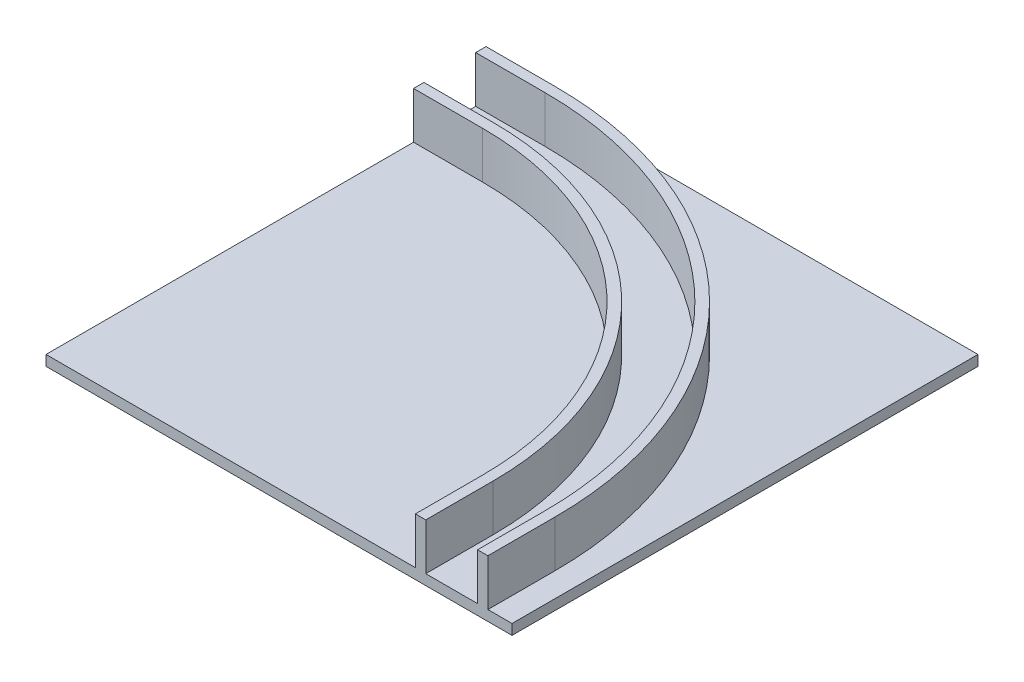
ISO-10303-21;
HEADER;
FILE_DESCRIPTION(('STEP AP214'),'2;1');
FILE_NAME('part.step','',(''),(''),'','','');
FILE_SCHEMA(('AUTOMOTIVE_DESIGN { 1 0 10303 214 1 1 1 1 }'));
ENDSEC;
DATA;
#1=APPLICATION_CONTEXT('core data for automotive mechanical design processes');
#2=APPLICATION_PROTOCOL_DEFINITION('international standard','automotive_design',2000,#1);
#3=PRODUCT_CONTEXT('',#1,'mechanical');
#4=PRODUCT('Part','Part','',(#3));
#5=PRODUCT_RELATED_PRODUCT_CATEGORY('part','',(#4));
#6=PRODUCT_DEFINITION_FORMATION('','',#4);
#7=PRODUCT_DEFINITION_CONTEXT('part definition',#1,'design');
#8=PRODUCT_DEFINITION('design','',#6,#7);
#9=PRODUCT_DEFINITION_SHAPE('','',#8);
#10=(LENGTH_UNIT() NAMED_UNIT(*) SI_UNIT(.MILLI.,.METRE.));
#11=(NAMED_UNIT(*) PLANE_ANGLE_UNIT() SI_UNIT($,.RADIAN.));
#12=(NAMED_UNIT(*) SI_UNIT($,.STERADIAN.) SOLID_ANGLE_UNIT());
#13=UNCERTAINTY_MEASURE_WITH_UNIT(LENGTH_MEASURE(1.E-05),#10,'distance_accuracy_value','');
#14=(GEOMETRIC_REPRESENTATION_CONTEXT(3) GLOBAL_UNCERTAINTY_ASSIGNED_CONTEXT((#13)) GLOBAL_UNIT_ASSIGNED_CONTEXT((#10,
#11,#12)) REPRESENTATION_CONTEXT('',''));
#15=CARTESIAN_POINT('',(0.,0.,0.));
#16=DIRECTION('',(0.,0.,1.));
#17=DIRECTION('',(1.,0.,0.));
#18=AXIS2_PLACEMENT_3D('',#15,#16,#17);
#19=CARTESIAN_POINT('',(0.,2.,0.));
#20=DIRECTION('',(0.,-1.,0.));
#21=DIRECTION('',(0.,0.,-1.));
#22=AXIS2_PLACEMENT_3D('',#19,#20,#21);
#23=PLANE('',#22);
#24=DIRECTION('',(0.,0.,1.));
#25=VECTOR('',#24,1.);
#26=CARTESIAN_POINT('',(26.3431101007559,2.,32.0158855578953));
#27=LINE('',#26,#25);
#28=CARTESIAN_POINT('',(26.3431101007559,2.,32.0158855578953));
#29=VERTEX_POINT('',#28);
#30=CARTESIAN_POINT('',(26.3431101007559,2.,45.));
#31=VERTEX_POINT('',#30);
#32=EDGE_CURVE('E250',#29,#31,#27,.T.);
#33=ORIENTED_EDGE('',*,*,#32,.F.);
#34=CARTESIAN_POINT('',(-31.6568898992441,2.,32.0158855578953));
#35=DIRECTION('',(0.,1.,0.));
#36=DIRECTION('',(1.,0.,0.));
#37=AXIS2_PLACEMENT_3D('',#34,#35,#36);
#38=CIRCLE('',#37,58.);
#39=CARTESIAN_POINT('',(-31.6568898992441,2.,-25.9841144421047));
#40=VERTEX_POINT('',#39);
#41=EDGE_CURVE('E244',#40,#29,#38,.F.);
#42=ORIENTED_EDGE('',*,*,#41,.F.);
#43=DIRECTION('',(1.,0.,0.));
#44=VECTOR('',#43,1.);
#45=CARTESIAN_POINT('',(-31.6568898992441,2.,-25.9841144421047));
#46=LINE('',#45,#44);
#47=CARTESIAN_POINT('',(-45.,2.,-25.9841144421047));
#48=VERTEX_POINT('',#47);
#49=EDGE_CURVE('E292',#48,#40,#46,.T.);
#50=ORIENTED_EDGE('',*,*,#49,.F.);
#51=DIRECTION('',(0.,0.,1.));
#52=VECTOR('',#51,1.);
#53=CARTESIAN_POINT('',(-45.,2.,-45.));
#54=LINE('',#53,#52);
#55=CARTESIAN_POINT('',(-45.,2.,45.));
#56=VERTEX_POINT('',#55);
#57=EDGE_CURVE('E405',#48,#56,#54,.T.);
#58=ORIENTED_EDGE('',*,*,#57,.T.);
#59=DIRECTION('',(1.,0.,0.));
#60=VECTOR('',#59,1.);
#61=CARTESIAN_POINT('',(45.,2.,45.));
#62=LINE('',#61,#60);
#63=EDGE_CURVE('E406',#56,#31,#62,.T.);
#64=ORIENTED_EDGE('',*,*,#63,.T.);
#65=EDGE_LOOP('',(#33,#42,#50,#58,#64));
#66=FACE_BOUND('',#65,.T.);
#67=ADVANCED_FACE('F93',(#66),#23,.F.);
#68=CARTESIAN_POINT('',(-31.6568898992441,2.,32.0158855578953));
#69=DIRECTION('',(0.,-1.,0.));
#70=DIRECTION('',(0.,0.,1.));
#71=AXIS2_PLACEMENT_3D('',#68,#69,#70);
#72=CIRCLE('',#71,60.);
#73=CARTESIAN_POINT('',(-31.6568898992441,2.,-27.9841144421047));
#74=VERTEX_POINT('',#73);
#75=CARTESIAN_POINT('',(28.3431101007559,2.,32.0158855578953));
#76=VERTEX_POINT('',#75);
#77=EDGE_CURVE('E109',#74,#76,#72,.T.);
#78=ORIENTED_EDGE('',*,*,#77,.T.);
#79=DIRECTION('',(0.,0.,1.));
#80=VECTOR('',#79,1.);
#81=CARTESIAN_POINT('',(28.3431101007559,2.,32.0158855578953));
#82=LINE('',#81,#80);
#83=CARTESIAN_POINT('',(28.3431101007559,2.,45.));
#84=VERTEX_POINT('',#83);
#85=EDGE_CURVE('E285',#76,#84,#82,.T.);
#86=ORIENTED_EDGE('',*,*,#85,.T.);
#87=CARTESIAN_POINT('',(38.3431101007559,2.,45.));
#88=VERTEX_POINT('',#87);
#89=EDGE_CURVE('E410',#84,#88,#62,.T.);
#90=ORIENTED_EDGE('',*,*,#89,.T.);
#91=DIRECTION('',(0.,0.,1.));
#92=VECTOR('',#91,1.);
#93=CARTESIAN_POINT('',(38.3431101007559,2.,32.0158855578953));
#94=LINE('',#93,#92);
#95=CARTESIAN_POINT('',(38.3431101007559,2.,32.0158855578953));
#96=VERTEX_POINT('',#95);
#97=EDGE_CURVE('E254',#96,#88,#94,.T.);
#98=ORIENTED_EDGE('',*,*,#97,.F.);
#99=CARTESIAN_POINT('',(-31.6568898992441,2.,32.0158855578953));
#100=DIRECTION('',(0.,1.,0.));
#101=DIRECTION('',(1.,0.,0.));
#102=AXIS2_PLACEMENT_3D('',#99,#100,#101);
#103=CIRCLE('',#102,70.);
#104=CARTESIAN_POINT('',(-31.6568898992441,2.,-37.9841144421047));
#105=VERTEX_POINT('',#104);
#106=EDGE_CURVE('E325',#105,#96,#103,.F.);
#107=ORIENTED_EDGE('',*,*,#106,.F.);
#108=DIRECTION('',(1.,0.,0.));
#109=VECTOR('',#108,1.);
#110=CARTESIAN_POINT('',(-31.6568898992441,2.,-37.9841144421047));
#111=LINE('',#110,#109);
#112=CARTESIAN_POINT('',(-45.,2.,-37.9841144421047));
#113=VERTEX_POINT('',#112);
#114=EDGE_CURVE('E367',#113,#105,#111,.T.);
#115=ORIENTED_EDGE('',*,*,#114,.F.);
#116=CARTESIAN_POINT('',(-45.,2.,-27.9841144421047));
#117=VERTEX_POINT('',#116);
#118=EDGE_CURVE('E404',#113,#117,#54,.T.);
#119=ORIENTED_EDGE('',*,*,#118,.T.);
#120=DIRECTION('',(1.,0.,0.));
#121=VECTOR('',#120,1.);
#122=CARTESIAN_POINT('',(-31.6568898992441,2.,-27.9841144421047));
#123=LINE('',#122,#121);
#124=EDGE_CURVE('E114',#117,#74,#123,.T.);
#125=ORIENTED_EDGE('',*,*,#124,.T.);
#126=EDGE_LOOP('',(#78,#86,#90,#98,#107,#115,#119,#125));
#127=FACE_BOUND('',#126,.T.);
#128=ADVANCED_FACE('F462',(#127),#23,.F.);
#129=CARTESIAN_POINT('',(-45.,2.,-45.));
#130=DIRECTION('',(1.,0.,0.));
#131=DIRECTION('',(0.,0.,-1.));
#132=AXIS2_PLACEMENT_3D('',#129,#130,#131);
#133=PLANE('',#132);
#134=DIRECTION('',(0.,0.,1.));
#135=VECTOR('',#134,1.);
#136=CARTESIAN_POINT('',(-45.,0.,-45.));
#137=LINE('',#136,#135);
#138=CARTESIAN_POINT('',(-45.,0.,-45.));
#139=VERTEX_POINT('',#138);
#140=CARTESIAN_POINT('',(-45.,0.,45.));
#141=VERTEX_POINT('',#140);
#142=EDGE_CURVE('E398',#139,#141,#137,.T.);
#143=ORIENTED_EDGE('',*,*,#142,.T.);
#144=DIRECTION('',(0.,-1.,0.));
#145=VECTOR('',#144,1.);
#146=CARTESIAN_POINT('',(-45.,2.,45.));
#147=LINE('',#146,#145);
#148=EDGE_CURVE('E12',#56,#141,#147,.T.);
#149=ORIENTED_EDGE('',*,*,#148,.F.);
#150=ORIENTED_EDGE('',*,*,#57,.F.);
#151=DIRECTION('',(0.,-1.,0.));
#152=VECTOR('',#151,1.);
#153=CARTESIAN_POINT('',(-45.,11.,-25.9841144421047));
#154=LINE('',#153,#152);
#155=CARTESIAN_POINT('',(-45.,11.,-25.9841144421047));
#156=VERTEX_POINT('',#155);
#157=EDGE_CURVE('E305',#156,#48,#154,.T.);
#158=ORIENTED_EDGE('',*,*,#157,.F.);
#159=DIRECTION('',(0.,0.,-1.));
#160=VECTOR('',#159,1.);
#161=CARTESIAN_POINT('',(-45.,11.,-25.9841144421047));
#162=LINE('',#161,#160);
#163=CARTESIAN_POINT('',(-45.,11.,-27.9841144421047));
#164=VERTEX_POINT('',#163);
#165=EDGE_CURVE('E273',#156,#164,#162,.T.);
#166=ORIENTED_EDGE('',*,*,#165,.T.);
#167=DIRECTION('',(0.,-1.,0.));
#168=VECTOR('',#167,1.);
#169=CARTESIAN_POINT('',(-45.,11.,-27.9841144421047));
#170=LINE('',#169,#168);
#171=EDGE_CURVE('E309',#164,#117,#170,.T.);
#172=ORIENTED_EDGE('',*,*,#171,.T.);
#173=ORIENTED_EDGE('',*,*,#118,.F.);
#174=DIRECTION('',(0.,-1.,0.));
#175=VECTOR('',#174,1.);
#176=CARTESIAN_POINT('',(-45.,11.,-37.9841144421047));
#177=LINE('',#176,#175);
#178=CARTESIAN_POINT('',(-45.,11.,-37.9841144421047));
#179=VERTEX_POINT('',#178);
#180=EDGE_CURVE('E379',#179,#113,#177,.T.);
#181=ORIENTED_EDGE('',*,*,#180,.F.);
#182=DIRECTION('',(0.,0.,-1.));
#183=VECTOR('',#182,1.);
#184=CARTESIAN_POINT('',(-45.,11.,-37.9841144421047));
#185=LINE('',#184,#183);
#186=CARTESIAN_POINT('',(-45.,11.,-39.9841144421047));
#187=VERTEX_POINT('',#186);
#188=EDGE_CURVE('E341',#179,#187,#185,.T.);
#189=ORIENTED_EDGE('',*,*,#188,.T.);
#190=DIRECTION('',(0.,-1.,0.));
#191=VECTOR('',#190,1.);
#192=CARTESIAN_POINT('',(-45.,11.,-39.9841144421047));
#193=LINE('',#192,#191);
#194=CARTESIAN_POINT('',(-45.,2.,-39.9841144421047));
#195=VERTEX_POINT('',#194);
#196=EDGE_CURVE('E382',#187,#195,#193,.T.);
#197=ORIENTED_EDGE('',*,*,#196,.T.);
#198=CARTESIAN_POINT('',(-45.,2.,-45.));
#199=VERTEX_POINT('',#198);
#200=EDGE_CURVE('E399',#199,#195,#54,.T.);
#201=ORIENTED_EDGE('',*,*,#200,.F.);
#202=DIRECTION('',(0.,-1.,0.));
#203=VECTOR('',#202,1.);
#204=CARTESIAN_POINT('',(-45.,2.,-45.));
#205=LINE('',#204,#203);
#206=EDGE_CURVE('E416',#199,#139,#205,.T.);
#207=ORIENTED_EDGE('',*,*,#206,.T.);
#208=EDGE_LOOP('',(#143,#149,#150,#158,#166,#172,#173,#181,#189,#197,#201,#207));
#209=FACE_BOUND('',#208,.T.);
#210=ADVANCED_FACE('F95',(#209),#133,.F.);
#211=CARTESIAN_POINT('',(45.,2.,45.));
#212=DIRECTION('',(0.,0.,-1.));
#213=DIRECTION('',(-1.,0.,0.));
#214=AXIS2_PLACEMENT_3D('',#211,#212,#213);
#215=PLANE('',#214);
#216=DIRECTION('',(1.,0.,0.));
#217=VECTOR('',#216,1.);
#218=CARTESIAN_POINT('',(45.,0.,45.));
#219=LINE('',#218,#217);
#220=CARTESIAN_POINT('',(45.,0.,45.));
#221=VERTEX_POINT('',#220);
#222=EDGE_CURVE('E420',#141,#221,#219,.T.);
#223=ORIENTED_EDGE('',*,*,#222,.T.);
#224=DIRECTION('',(0.,-1.,0.));
#225=VECTOR('',#224,1.);
#226=CARTESIAN_POINT('',(45.,2.,45.));
#227=LINE('',#226,#225);
#228=CARTESIAN_POINT('',(45.,2.,45.));
#229=VERTEX_POINT('',#228);
#230=EDGE_CURVE('E102',#229,#221,#227,.T.);
#231=ORIENTED_EDGE('',*,*,#230,.F.);
#232=CARTESIAN_POINT('',(40.3431101007559,2.,45.));
#233=VERTEX_POINT('',#232);
#234=EDGE_CURVE('E403',#233,#229,#62,.T.);
#235=ORIENTED_EDGE('',*,*,#234,.F.);
#236=DIRECTION('',(0.,-1.,0.));
#237=VECTOR('',#236,1.);
#238=CARTESIAN_POINT('',(40.3431101007559,11.,45.));
#239=LINE('',#238,#237);
#240=CARTESIAN_POINT('',(40.3431101007559,11.,45.));
#241=VERTEX_POINT('',#240);
#242=EDGE_CURVE('E391',#241,#233,#239,.T.);
#243=ORIENTED_EDGE('',*,*,#242,.F.);
#244=DIRECTION('',(-1.,0.,0.));
#245=VECTOR('',#244,1.);
#246=CARTESIAN_POINT('',(40.3431101007559,11.,45.));
#247=LINE('',#246,#245);
#248=CARTESIAN_POINT('',(38.3431101007559,11.,45.));
#249=VERTEX_POINT('',#248);
#250=EDGE_CURVE('E324',#241,#249,#247,.T.);
#251=ORIENTED_EDGE('',*,*,#250,.T.);
#252=DIRECTION('',(0.,-1.,0.));
#253=VECTOR('',#252,1.);
#254=CARTESIAN_POINT('',(38.3431101007559,11.,45.));
#255=LINE('',#254,#253);
#256=EDGE_CURVE('E394',#249,#88,#255,.T.);
#257=ORIENTED_EDGE('',*,*,#256,.T.);
#258=ORIENTED_EDGE('',*,*,#89,.F.);
#259=DIRECTION('',(0.,-1.,0.));
#260=VECTOR('',#259,1.);
#261=CARTESIAN_POINT('',(28.3431101007559,11.,45.));
#262=LINE('',#261,#260);
#263=CARTESIAN_POINT('',(28.3431101007559,11.,45.));
#264=VERTEX_POINT('',#263);
#265=EDGE_CURVE('E255',#264,#84,#262,.T.);
#266=ORIENTED_EDGE('',*,*,#265,.F.);
#267=DIRECTION('',(-1.,0.,0.));
#268=VECTOR('',#267,1.);
#269=CARTESIAN_POINT('',(28.3431101007559,11.,45.));
#270=LINE('',#269,#268);
#271=CARTESIAN_POINT('',(26.3431101007559,11.,45.));
#272=VERTEX_POINT('',#271);
#273=EDGE_CURVE('E236',#264,#272,#270,.T.);
#274=ORIENTED_EDGE('',*,*,#273,.T.);
#275=DIRECTION('',(0.,-1.,0.));
#276=VECTOR('',#275,1.);
#277=CARTESIAN_POINT('',(26.3431101007559,11.,45.));
#278=LINE('',#277,#276);
#279=EDGE_CURVE('E248',#272,#31,#278,.T.);
#280=ORIENTED_EDGE('',*,*,#279,.T.);
#281=ORIENTED_EDGE('',*,*,#63,.F.);
#282=ORIENTED_EDGE('',*,*,#148,.T.);
#283=EDGE_LOOP('',(#223,#231,#235,#243,#251,#257,#258,#266,#274,#280,#281,#282));
#284=FACE_BOUND('',#283,.T.);
#285=ADVANCED_FACE('F257',(#284),#215,.F.);
#286=CARTESIAN_POINT('',(45.,2.,-45.));
#287=DIRECTION('',(-1.,0.,0.));
#288=DIRECTION('',(0.,0.,1.));
#289=AXIS2_PLACEMENT_3D('',#286,#287,#288);
#290=PLANE('',#289);
#291=DIRECTION('',(0.,0.,-1.));
#292=VECTOR('',#291,1.);
#293=CARTESIAN_POINT('',(45.,0.,-45.));
#294=LINE('',#293,#292);
#295=CARTESIAN_POINT('',(45.,0.,-45.));
#296=VERTEX_POINT('',#295);
#297=EDGE_CURVE('E423',#221,#296,#294,.T.);
#298=ORIENTED_EDGE('',*,*,#297,.T.);
#299=DIRECTION('',(0.,-1.,0.));
#300=VECTOR('',#299,1.);
#301=CARTESIAN_POINT('',(45.,2.,-45.));
#302=LINE('',#301,#300);
#303=CARTESIAN_POINT('',(45.,2.,-45.));
#304=VERTEX_POINT('',#303);
#305=EDGE_CURVE('E432',#304,#296,#302,.T.);
#306=ORIENTED_EDGE('',*,*,#305,.F.);
#307=DIRECTION('',(0.,0.,-1.));
#308=VECTOR('',#307,1.);
#309=CARTESIAN_POINT('',(45.,2.,-45.));
#310=LINE('',#309,#308);
#311=EDGE_CURVE('E409',#229,#304,#310,.T.);
#312=ORIENTED_EDGE('',*,*,#311,.F.);
#313=ORIENTED_EDGE('',*,*,#230,.T.);
#314=EDGE_LOOP('',(#298,#306,#312,#313));
#315=FACE_BOUND('',#314,.T.);
#316=ADVANCED_FACE('F441',(#315),#290,.F.);
#317=CARTESIAN_POINT('',(45.,2.,-45.));
#318=DIRECTION('',(0.,0.,1.));
#319=DIRECTION('',(1.,0.,0.));
#320=AXIS2_PLACEMENT_3D('',#317,#318,#319);
#321=PLANE('',#320);
#322=DIRECTION('',(-1.,0.,0.));
#323=VECTOR('',#322,1.);
#324=CARTESIAN_POINT('',(45.,0.,-45.));
#325=LINE('',#324,#323);
#326=EDGE_CURVE('E426',#296,#139,#325,.T.);
#327=ORIENTED_EDGE('',*,*,#326,.T.);
#328=ORIENTED_EDGE('',*,*,#206,.F.);
#329=DIRECTION('',(-1.,0.,0.));
#330=VECTOR('',#329,1.);
#331=CARTESIAN_POINT('',(45.,2.,-45.));
#332=LINE('',#331,#330);
#333=EDGE_CURVE('E413',#304,#199,#332,.T.);
#334=ORIENTED_EDGE('',*,*,#333,.F.);
#335=ORIENTED_EDGE('',*,*,#305,.T.);
#336=EDGE_LOOP('',(#327,#328,#334,#335));
#337=FACE_BOUND('',#336,.T.);
#338=ADVANCED_FACE('F450',(#337),#321,.F.);
#339=ORIENTED_EDGE('',*,*,#200,.T.);
#340=DIRECTION('',(1.,0.,0.));
#341=VECTOR('',#340,1.);
#342=CARTESIAN_POINT('',(-31.6568898992441,2.,-39.9841144421047));
#343=LINE('',#342,#341);
#344=CARTESIAN_POINT('',(-31.6568898992441,2.,-39.9841144421047));
#345=VERTEX_POINT('',#344);
#346=EDGE_CURVE('E363',#195,#345,#343,.T.);
#347=ORIENTED_EDGE('',*,*,#346,.T.);
#348=CARTESIAN_POINT('',(-31.6568898992441,2.,32.0158855578953));
#349=DIRECTION('',(0.,-1.,0.));
#350=DIRECTION('',(0.,0.,1.));
#351=AXIS2_PLACEMENT_3D('',#348,#349,#350);
#352=CIRCLE('',#351,72.);
#353=CARTESIAN_POINT('',(40.3431101007559,2.,32.0158855578953));
#354=VERTEX_POINT('',#353);
#355=EDGE_CURVE('E359',#345,#354,#352,.T.);
#356=ORIENTED_EDGE('',*,*,#355,.T.);
#357=DIRECTION('',(0.,0.,1.));
#358=VECTOR('',#357,1.);
#359=CARTESIAN_POINT('',(40.3431101007559,2.,32.0158855578953));
#360=LINE('',#359,#358);
#361=EDGE_CURVE('E355',#354,#233,#360,.T.);
#362=ORIENTED_EDGE('',*,*,#361,.T.);
#363=ORIENTED_EDGE('',*,*,#234,.T.);
#364=ORIENTED_EDGE('',*,*,#311,.T.);
#365=ORIENTED_EDGE('',*,*,#333,.T.);
#366=EDGE_LOOP('',(#339,#347,#356,#362,#363,#364,#365));
#367=FACE_BOUND('',#366,.T.);
#368=ADVANCED_FACE('F457',(#367),#23,.F.);
#369=CARTESIAN_POINT('',(0.,0.,0.));
#370=DIRECTION('',(0.,-1.,0.));
#371=DIRECTION('',(0.,0.,-1.));
#372=AXIS2_PLACEMENT_3D('',#369,#370,#371);
#373=PLANE('',#372);
#374=ORIENTED_EDGE('',*,*,#142,.F.);
#375=ORIENTED_EDGE('',*,*,#326,.F.);
#376=ORIENTED_EDGE('',*,*,#297,.F.);
#377=ORIENTED_EDGE('',*,*,#222,.F.);
#378=EDGE_LOOP('',(#374,#375,#376,#377));
#379=FACE_BOUND('',#378,.T.);
#380=ADVANCED_FACE('F447',(#379),#373,.T.);
#381=CARTESIAN_POINT('',(38.3431101007559,11.,32.0158855578953));
#382=DIRECTION('',(1.,0.,0.));
#383=DIRECTION('',(0.,0.,-1.));
#384=AXIS2_PLACEMENT_3D('',#381,#382,#383);
#385=PLANE('',#384);
#386=ORIENTED_EDGE('',*,*,#97,.T.);
#387=ORIENTED_EDGE('',*,*,#256,.F.);
#388=DIRECTION('',(0.,0.,1.));
#389=VECTOR('',#388,1.);
#390=CARTESIAN_POINT('',(38.3431101007559,11.,32.0158855578953));
#391=LINE('',#390,#389);
#392=CARTESIAN_POINT('',(38.3431101007559,11.,32.0158855578953));
#393=VERTEX_POINT('',#392);
#394=EDGE_CURVE('E321',#393,#249,#391,.T.);
#395=ORIENTED_EDGE('',*,*,#394,.F.);
#396=DIRECTION('',(0.,-1.,0.));
#397=VECTOR('',#396,1.);
#398=CARTESIAN_POINT('',(38.3431101007559,11.,32.0158855578953));
#399=LINE('',#398,#397);
#400=EDGE_CURVE('E351',#393,#96,#399,.T.);
#401=ORIENTED_EDGE('',*,*,#400,.T.);
#402=EDGE_LOOP('',(#386,#387,#395,#401));
#403=FACE_BOUND('',#402,.T.);
#404=ADVANCED_FACE('F469',(#403),#385,.F.);
#405=CARTESIAN_POINT('',(40.3431101007559,11.,32.0158855578953));
#406=DIRECTION('',(1.,0.,0.));
#407=DIRECTION('',(0.,0.,-1.));
#408=AXIS2_PLACEMENT_3D('',#405,#406,#407);
#409=PLANE('',#408);
#410=ORIENTED_EDGE('',*,*,#361,.F.);
#411=DIRECTION('',(0.,-1.,0.));
#412=VECTOR('',#411,1.);
#413=CARTESIAN_POINT('',(40.3431101007559,11.,32.0158855578953));
#414=LINE('',#413,#412);
#415=CARTESIAN_POINT('',(40.3431101007559,11.,32.0158855578953));
#416=VERTEX_POINT('',#415);
#417=EDGE_CURVE('E388',#416,#354,#414,.T.);
#418=ORIENTED_EDGE('',*,*,#417,.F.);
#419=DIRECTION('',(0.,0.,1.));
#420=VECTOR('',#419,1.);
#421=CARTESIAN_POINT('',(40.3431101007559,11.,32.0158855578953));
#422=LINE('',#421,#420);
#423=EDGE_CURVE('E329',#416,#241,#422,.T.);
#424=ORIENTED_EDGE('',*,*,#423,.T.);
#425=ORIENTED_EDGE('',*,*,#242,.T.);
#426=EDGE_LOOP('',(#410,#418,#424,#425));
#427=FACE_BOUND('',#426,.T.);
#428=ADVANCED_FACE('F583',(#427),#409,.T.);
#429=CARTESIAN_POINT('',(-31.6568898992441,11.,32.0158855578953));
#430=DIRECTION('',(0.,-1.,0.));
#431=DIRECTION('',(0.,0.,-1.));
#432=AXIS2_PLACEMENT_3D('',#429,#430,#431);
#433=CYLINDRICAL_SURFACE('',#432,72.);
#434=ORIENTED_EDGE('',*,*,#355,.F.);
#435=DIRECTION('',(0.,-1.,0.));
#436=VECTOR('',#435,1.);
#437=CARTESIAN_POINT('',(-31.6568898992441,11.,-39.9841144421047));
#438=LINE('',#437,#436);
#439=CARTESIAN_POINT('',(-31.6568898992441,11.,-39.9841144421047));
#440=VERTEX_POINT('',#439);
#441=EDGE_CURVE('E385',#440,#345,#438,.T.);
#442=ORIENTED_EDGE('',*,*,#441,.F.);
#443=CARTESIAN_POINT('',(-31.6568898992441,11.,32.0158855578953));
#444=DIRECTION('',(0.,-1.,0.));
#445=DIRECTION('',(0.,0.,1.));
#446=AXIS2_PLACEMENT_3D('',#443,#444,#445);
#447=CIRCLE('',#446,72.);
#448=EDGE_CURVE('E333',#440,#416,#447,.T.);
#449=ORIENTED_EDGE('',*,*,#448,.T.);
#450=ORIENTED_EDGE('',*,*,#417,.T.);
#451=EDGE_LOOP('',(#434,#442,#449,#450));
#452=FACE_BOUND('',#451,.T.);
#453=ADVANCED_FACE('F591',(#452),#433,.T.);
#454=CARTESIAN_POINT('',(-31.6568898992441,11.,-39.9841144421047));
#455=DIRECTION('',(0.,0.,-1.));
#456=DIRECTION('',(-1.,0.,0.));
#457=AXIS2_PLACEMENT_3D('',#454,#455,#456);
#458=PLANE('',#457);
#459=ORIENTED_EDGE('',*,*,#346,.F.);
#460=ORIENTED_EDGE('',*,*,#196,.F.);
#461=DIRECTION('',(1.,0.,0.));
#462=VECTOR('',#461,1.);
#463=CARTESIAN_POINT('',(-31.6568898992441,11.,-39.9841144421047));
#464=LINE('',#463,#462);
#465=EDGE_CURVE('E337',#187,#440,#464,.T.);
#466=ORIENTED_EDGE('',*,*,#465,.T.);
#467=ORIENTED_EDGE('',*,*,#441,.T.);
#468=EDGE_LOOP('',(#459,#460,#466,#467));
#469=FACE_BOUND('',#468,.T.);
#470=ADVANCED_FACE('F601',(#469),#458,.T.);
#471=CARTESIAN_POINT('',(-31.6568898992441,11.,-37.9841144421047));
#472=DIRECTION('',(0.,0.,-1.));
#473=DIRECTION('',(-1.,0.,0.));
#474=AXIS2_PLACEMENT_3D('',#471,#472,#473);
#475=PLANE('',#474);
#476=ORIENTED_EDGE('',*,*,#114,.T.);
#477=DIRECTION('',(0.,-1.,0.));
#478=VECTOR('',#477,1.);
#479=CARTESIAN_POINT('',(-31.6568898992441,11.,-37.9841144421047));
#480=LINE('',#479,#478);
#481=CARTESIAN_POINT('',(-31.6568898992441,11.,-37.9841144421047));
#482=VERTEX_POINT('',#481);
#483=EDGE_CURVE('E375',#482,#105,#480,.T.);
#484=ORIENTED_EDGE('',*,*,#483,.F.);
#485=DIRECTION('',(1.,0.,0.));
#486=VECTOR('',#485,1.);
#487=CARTESIAN_POINT('',(-31.6568898992441,11.,-37.9841144421047));
#488=LINE('',#487,#486);
#489=EDGE_CURVE('E345',#179,#482,#488,.T.);
#490=ORIENTED_EDGE('',*,*,#489,.F.);
#491=ORIENTED_EDGE('',*,*,#180,.T.);
#492=EDGE_LOOP('',(#476,#484,#490,#491));
#493=FACE_BOUND('',#492,.T.);
#494=ADVANCED_FACE('F611',(#493),#475,.F.);
#495=CARTESIAN_POINT('',(-31.6568898992441,11.,32.0158855578953));
#496=DIRECTION('',(0.,-1.,0.));
#497=DIRECTION('',(0.,0.,-1.));
#498=AXIS2_PLACEMENT_3D('',#495,#496,#497);
#499=CYLINDRICAL_SURFACE('',#498,70.);
#500=ORIENTED_EDGE('',*,*,#106,.T.);
#501=ORIENTED_EDGE('',*,*,#400,.F.);
#502=CARTESIAN_POINT('',(-31.6568898992441,11.,32.0158855578953));
#503=DIRECTION('',(0.,1.,0.));
#504=DIRECTION('',(1.,0.,0.));
#505=AXIS2_PLACEMENT_3D('',#502,#503,#504);
#506=CIRCLE('',#505,70.);
#507=EDGE_CURVE('E348',#482,#393,#506,.F.);
#508=ORIENTED_EDGE('',*,*,#507,.F.);
#509=ORIENTED_EDGE('',*,*,#483,.T.);
#510=EDGE_LOOP('',(#500,#501,#508,#509));
#511=FACE_BOUND('',#510,.T.);
#512=ADVANCED_FACE('F473',(#511),#499,.F.);
#513=CARTESIAN_POINT('',(-31.6568898992441,11.,32.0158855578953));
#514=DIRECTION('',(0.,-1.,0.));
#515=DIRECTION('',(-1.,0.,0.));
#516=AXIS2_PLACEMENT_3D('',#513,#514,#515);
#517=PLANE('',#516);
#518=ORIENTED_EDGE('',*,*,#394,.T.);
#519=ORIENTED_EDGE('',*,*,#250,.F.);
#520=ORIENTED_EDGE('',*,*,#423,.F.);
#521=ORIENTED_EDGE('',*,*,#448,.F.);
#522=ORIENTED_EDGE('',*,*,#465,.F.);
#523=ORIENTED_EDGE('',*,*,#188,.F.);
#524=ORIENTED_EDGE('',*,*,#489,.T.);
#525=ORIENTED_EDGE('',*,*,#507,.T.);
#526=EDGE_LOOP('',(#518,#519,#520,#521,#522,#523,#524,#525));
#527=FACE_BOUND('',#526,.T.);
#528=ADVANCED_FACE('F503',(#527),#517,.F.);
#529=CARTESIAN_POINT('',(26.3431101007559,11.,32.0158855578953));
#530=DIRECTION('',(1.,0.,0.));
#531=DIRECTION('',(0.,0.,-1.));
#532=AXIS2_PLACEMENT_3D('',#529,#530,#531);
#533=PLANE('',#532);
#534=ORIENTED_EDGE('',*,*,#32,.T.);
#535=ORIENTED_EDGE('',*,*,#279,.F.);
#536=DIRECTION('',(0.,0.,1.));
#537=VECTOR('',#536,1.);
#538=CARTESIAN_POINT('',(26.3431101007559,11.,32.0158855578953));
#539=LINE('',#538,#537);
#540=CARTESIAN_POINT('',(26.3431101007559,11.,32.0158855578953));
#541=VERTEX_POINT('',#540);
#542=EDGE_CURVE('E231',#541,#272,#539,.T.);
#543=ORIENTED_EDGE('',*,*,#542,.F.);
#544=DIRECTION('',(0.,-1.,0.));
#545=VECTOR('',#544,1.);
#546=CARTESIAN_POINT('',(26.3431101007559,11.,32.0158855578953));
#547=LINE('',#546,#545);
#548=EDGE_CURVE('E282',#541,#29,#547,.T.);
#549=ORIENTED_EDGE('',*,*,#548,.T.);
#550=EDGE_LOOP('',(#534,#535,#543,#549));
#551=FACE_BOUND('',#550,.T.);
#552=ADVANCED_FACE('F249',(#551),#533,.F.);
#553=CARTESIAN_POINT('',(28.3431101007559,11.,32.0158855578953));
#554=DIRECTION('',(1.,0.,0.));
#555=DIRECTION('',(0.,0.,-1.));
#556=AXIS2_PLACEMENT_3D('',#553,#554,#555);
#557=PLANE('',#556);
#558=ORIENTED_EDGE('',*,*,#85,.F.);
#559=DIRECTION('',(0.,-1.,0.));
#560=VECTOR('',#559,1.);
#561=CARTESIAN_POINT('',(28.3431101007559,11.,32.0158855578953));
#562=LINE('',#561,#560);
#563=CARTESIAN_POINT('',(28.3431101007559,11.,32.0158855578953));
#564=VERTEX_POINT('',#563);
#565=EDGE_CURVE('E316',#564,#76,#562,.T.);
#566=ORIENTED_EDGE('',*,*,#565,.F.);
#567=DIRECTION('',(0.,0.,1.));
#568=VECTOR('',#567,1.);
#569=CARTESIAN_POINT('',(28.3431101007559,11.,32.0158855578953));
#570=LINE('',#569,#568);
#571=EDGE_CURVE('E260',#564,#264,#570,.T.);
#572=ORIENTED_EDGE('',*,*,#571,.T.);
#573=ORIENTED_EDGE('',*,*,#265,.T.);
#574=EDGE_LOOP('',(#558,#566,#572,#573));
#575=FACE_BOUND('',#574,.T.);
#576=ADVANCED_FACE('F495',(#575),#557,.T.);
#577=CARTESIAN_POINT('',(-31.6568898992441,11.,32.0158855578953));
#578=DIRECTION('',(0.,-1.,0.));
#579=DIRECTION('',(0.,0.,-1.));
#580=AXIS2_PLACEMENT_3D('',#577,#578,#579);
#581=CYLINDRICAL_SURFACE('',#580,60.);
#582=ORIENTED_EDGE('',*,*,#77,.F.);
#583=DIRECTION('',(0.,-1.,0.));
#584=VECTOR('',#583,1.);
#585=CARTESIAN_POINT('',(-31.6568898992441,11.,-27.9841144421047));
#586=LINE('',#585,#584);
#587=CARTESIAN_POINT('',(-31.6568898992441,11.,-27.9841144421047));
#588=VERTEX_POINT('',#587);
#589=EDGE_CURVE('E313',#588,#74,#586,.T.);
#590=ORIENTED_EDGE('',*,*,#589,.F.);
#591=CARTESIAN_POINT('',(-31.6568898992441,11.,32.0158855578953));
#592=DIRECTION('',(0.,-1.,0.));
#593=DIRECTION('',(0.,0.,1.));
#594=AXIS2_PLACEMENT_3D('',#591,#592,#593);
#595=CIRCLE('',#594,60.);
#596=EDGE_CURVE('E263',#588,#564,#595,.T.);
#597=ORIENTED_EDGE('',*,*,#596,.T.);
#598=ORIENTED_EDGE('',*,*,#565,.T.);
#599=EDGE_LOOP('',(#582,#590,#597,#598));
#600=FACE_BOUND('',#599,.T.);
#601=ADVANCED_FACE('F493',(#600),#581,.T.);
#602=CARTESIAN_POINT('',(-31.6568898992441,11.,-27.9841144421047));
#603=DIRECTION('',(0.,0.,-1.));
#604=DIRECTION('',(-1.,0.,0.));
#605=AXIS2_PLACEMENT_3D('',#602,#603,#604);
#606=PLANE('',#605);
#607=ORIENTED_EDGE('',*,*,#124,.F.);
#608=ORIENTED_EDGE('',*,*,#171,.F.);
#609=DIRECTION('',(1.,0.,0.));
#610=VECTOR('',#609,1.);
#611=CARTESIAN_POINT('',(-31.6568898992441,11.,-27.9841144421047));
#612=LINE('',#611,#610);
#613=EDGE_CURVE('E269',#164,#588,#612,.T.);
#614=ORIENTED_EDGE('',*,*,#613,.T.);
#615=ORIENTED_EDGE('',*,*,#589,.T.);
#616=EDGE_LOOP('',(#607,#608,#614,#615));
#617=FACE_BOUND('',#616,.T.);
#618=ADVANCED_FACE('F491',(#617),#606,.T.);
#619=CARTESIAN_POINT('',(-31.6568898992441,11.,-25.9841144421047));
#620=DIRECTION('',(0.,0.,-1.));
#621=DIRECTION('',(-1.,0.,0.));
#622=AXIS2_PLACEMENT_3D('',#619,#620,#621);
#623=PLANE('',#622);
#624=ORIENTED_EDGE('',*,*,#49,.T.);
#625=DIRECTION('',(0.,-1.,0.));
#626=VECTOR('',#625,1.);
#627=CARTESIAN_POINT('',(-31.6568898992441,11.,-25.9841144421047));
#628=LINE('',#627,#626);
#629=CARTESIAN_POINT('',(-31.6568898992441,11.,-25.9841144421047));
#630=VERTEX_POINT('',#629);
#631=EDGE_CURVE('E301',#630,#40,#628,.T.);
#632=ORIENTED_EDGE('',*,*,#631,.F.);
#633=DIRECTION('',(1.,0.,0.));
#634=VECTOR('',#633,1.);
#635=CARTESIAN_POINT('',(-31.6568898992441,11.,-25.9841144421047));
#636=LINE('',#635,#634);
#637=EDGE_CURVE('E277',#156,#630,#636,.T.);
#638=ORIENTED_EDGE('',*,*,#637,.F.);
#639=ORIENTED_EDGE('',*,*,#157,.T.);
#640=EDGE_LOOP('',(#624,#632,#638,#639));
#641=FACE_BOUND('',#640,.T.);
#642=ADVANCED_FACE('F485',(#641),#623,.F.);
#643=CARTESIAN_POINT('',(-31.6568898992441,11.,32.0158855578953));
#644=DIRECTION('',(0.,-1.,0.));
#645=DIRECTION('',(0.,0.,-1.));
#646=AXIS2_PLACEMENT_3D('',#643,#644,#645);
#647=CYLINDRICAL_SURFACE('',#646,58.);
#648=ORIENTED_EDGE('',*,*,#41,.T.);
#649=ORIENTED_EDGE('',*,*,#548,.F.);
#650=CARTESIAN_POINT('',(-31.6568898992441,11.,32.0158855578953));
#651=DIRECTION('',(0.,1.,0.));
#652=DIRECTION('',(1.,0.,0.));
#653=AXIS2_PLACEMENT_3D('',#650,#651,#652);
#654=CIRCLE('',#653,58.);
#655=EDGE_CURVE('E239',#630,#541,#654,.F.);
#656=ORIENTED_EDGE('',*,*,#655,.F.);
#657=ORIENTED_EDGE('',*,*,#631,.T.);
#658=EDGE_LOOP('',(#648,#649,#656,#657));
#659=FACE_BOUND('',#658,.T.);
#660=ADVANCED_FACE('F670',(#659),#647,.F.);
#661=CARTESIAN_POINT('',(-31.6568898992441,11.,32.0158855578953));
#662=DIRECTION('',(0.,-1.,0.));
#663=DIRECTION('',(-1.,0.,0.));
#664=AXIS2_PLACEMENT_3D('',#661,#662,#663);
#665=PLANE('',#664);
#666=ORIENTED_EDGE('',*,*,#542,.T.);
#667=ORIENTED_EDGE('',*,*,#273,.F.);
#668=ORIENTED_EDGE('',*,*,#571,.F.);
#669=ORIENTED_EDGE('',*,*,#596,.F.);
#670=ORIENTED_EDGE('',*,*,#613,.F.);
#671=ORIENTED_EDGE('',*,*,#165,.F.);
#672=ORIENTED_EDGE('',*,*,#637,.T.);
#673=ORIENTED_EDGE('',*,*,#655,.T.);
#674=EDGE_LOOP('',(#666,#667,#668,#669,#670,#671,#672,#673));
#675=FACE_BOUND('',#674,.T.);
#676=ADVANCED_FACE('F233',(#675),#665,.F.);
#677=CLOSED_SHELL('',(#67,#128,#210,#285,#316,#338,#368,#380,#404,#428,#453,#470,#494,#512,#528,
#552,#576,#601,#618,#642,#660,#676));
#678=MANIFOLD_SOLID_BREP('B2',#677);
#679=ADVANCED_BREP_SHAPE_REPRESENTATION('',(#18,#678),#14);
#680=SHAPE_DEFINITION_REPRESENTATION(#9,#679);
ENDSEC;
END-ISO-10303-21;
